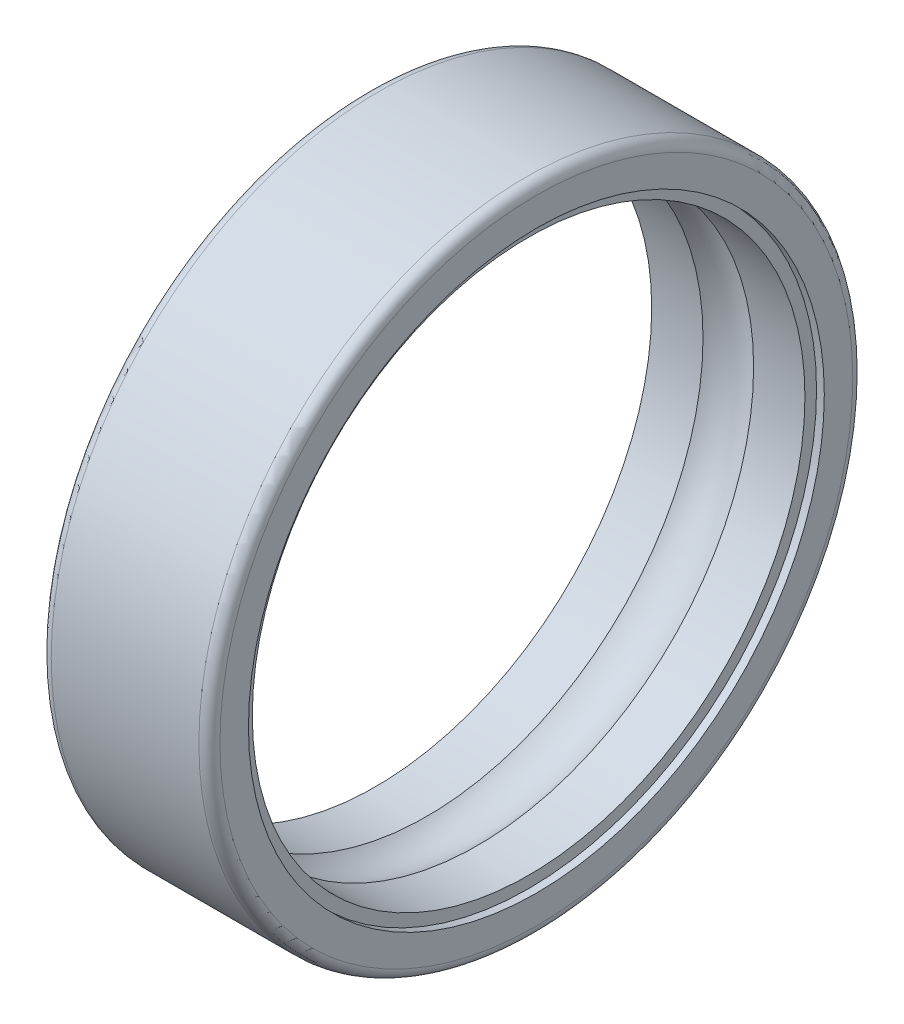
ISO-10303-21;
HEADER;
FILE_DESCRIPTION(('STEP AP214'),'2;1');
FILE_NAME('part.step','',(''),(''),'','','');
FILE_SCHEMA(('AUTOMOTIVE_DESIGN { 1 0 10303 214 1 1 1 1 }'));
ENDSEC;
DATA;
#1=APPLICATION_CONTEXT('core data for automotive mechanical design processes');
#2=APPLICATION_PROTOCOL_DEFINITION('international standard','automotive_design',2000,#1);
#3=PRODUCT_CONTEXT('',#1,'mechanical');
#4=PRODUCT('Part','Part','',(#3));
#5=PRODUCT_RELATED_PRODUCT_CATEGORY('part','',(#4));
#6=PRODUCT_DEFINITION_FORMATION('','',#4);
#7=PRODUCT_DEFINITION_CONTEXT('part definition',#1,'design');
#8=PRODUCT_DEFINITION('design','',#6,#7);
#9=PRODUCT_DEFINITION_SHAPE('','',#8);
#10=(LENGTH_UNIT() NAMED_UNIT(*) SI_UNIT(.MILLI.,.METRE.));
#11=(NAMED_UNIT(*) PLANE_ANGLE_UNIT() SI_UNIT($,.RADIAN.));
#12=(NAMED_UNIT(*) SI_UNIT($,.STERADIAN.) SOLID_ANGLE_UNIT());
#13=UNCERTAINTY_MEASURE_WITH_UNIT(LENGTH_MEASURE(1.E-05),#10,'distance_accuracy_value','');
#14=(GEOMETRIC_REPRESENTATION_CONTEXT(3) GLOBAL_UNCERTAINTY_ASSIGNED_CONTEXT((#13)) GLOBAL_UNIT_ASSIGNED_CONTEXT((#10,
#11,#12)) REPRESENTATION_CONTEXT('',''));
#15=CARTESIAN_POINT('',(0.,0.,0.));
#16=DIRECTION('',(0.,0.,1.));
#17=DIRECTION('',(1.,0.,0.));
#18=AXIS2_PLACEMENT_3D('',#15,#16,#17);
#19=CARTESIAN_POINT('',(0.,-30.5572903122836,-30.));
#20=DIRECTION('',(-1.,0.,0.));
#21=DIRECTION('',(0.,0.,1.));
#22=AXIS2_PLACEMENT_3D('',#19,#20,#21);
#23=PLANE('',#22);
#24=CARTESIAN_POINT('',(0.,0.,0.));
#25=DIRECTION('',(-1.,0.,0.));
#26=DIRECTION('',(0.,0.,-1.));
#27=AXIS2_PLACEMENT_3D('',#24,#25,#26);
#28=CIRCLE('',#27,30.);
#29=CARTESIAN_POINT('',(0.,0.,-30.));
#30=VERTEX_POINT('',#29);
#31=EDGE_CURVE('E55',#30,#30,#28,.F.);
#32=ORIENTED_EDGE('',*,*,#31,.F.);
#33=EDGE_LOOP('',(#32));
#34=FACE_BOUND('',#33,.T.);
#35=CARTESIAN_POINT('',(0.,0.,0.));
#36=DIRECTION('',(1.,0.,0.));
#37=DIRECTION('',(0.,0.,1.));
#38=AXIS2_PLACEMENT_3D('',#35,#36,#37);
#39=CIRCLE('',#38,27.3);
#40=CARTESIAN_POINT('',(0.,0.,27.3));
#41=VERTEX_POINT('',#40);
#42=EDGE_CURVE('E52',#41,#41,#39,.T.);
#43=ORIENTED_EDGE('',*,*,#42,.T.);
#44=EDGE_LOOP('',(#43));
#45=FACE_BOUND('',#44,.T.);
#46=ADVANCED_FACE('F14',(#34,#45),#23,.T.);
#47=CARTESIAN_POINT('',(0.736,-27.8071341841781,-27.3));
#48=DIRECTION('',(-1.,0.,0.));
#49=DIRECTION('',(0.,0.,1.));
#50=AXIS2_PLACEMENT_3D('',#47,#48,#49);
#51=PLANE('',#50);
#52=CARTESIAN_POINT('',(0.736,0.,0.));
#53=DIRECTION('',(-1.,0.,0.));
#54=DIRECTION('',(0.,0.,-1.));
#55=AXIS2_PLACEMENT_3D('',#52,#53,#54);
#56=CIRCLE('',#55,27.3);
#57=CARTESIAN_POINT('',(0.736,0.,-27.3));
#58=VERTEX_POINT('',#57);
#59=EDGE_CURVE('E49',#58,#58,#56,.F.);
#60=ORIENTED_EDGE('',*,*,#59,.F.);
#61=EDGE_LOOP('',(#60));
#62=FACE_BOUND('',#61,.T.);
#63=CARTESIAN_POINT('',(0.736,0.,0.));
#64=DIRECTION('',(1.,0.,0.));
#65=DIRECTION('',(0.,0.,1.));
#66=AXIS2_PLACEMENT_3D('',#63,#64,#65);
#67=CIRCLE('',#66,26.2);
#68=CARTESIAN_POINT('',(0.736,0.,26.2));
#69=VERTEX_POINT('',#68);
#70=EDGE_CURVE('E46',#69,#69,#67,.T.);
#71=ORIENTED_EDGE('',*,*,#70,.T.);
#72=EDGE_LOOP('',(#71));
#73=FACE_BOUND('',#72,.T.);
#74=ADVANCED_FACE('F63',(#62,#73),#51,.T.);
#75=CARTESIAN_POINT('',(15.264,-27.8071341841781,27.3));
#76=DIRECTION('',(1.,0.,0.));
#77=DIRECTION('',(0.,0.,-1.));
#78=AXIS2_PLACEMENT_3D('',#75,#76,#77);
#79=PLANE('',#78);
#80=CARTESIAN_POINT('',(15.264,0.,0.));
#81=DIRECTION('',(1.,0.,0.));
#82=DIRECTION('',(0.,0.,1.));
#83=AXIS2_PLACEMENT_3D('',#80,#81,#82);
#84=CIRCLE('',#83,27.3);
#85=CARTESIAN_POINT('',(15.264,0.,27.3));
#86=VERTEX_POINT('',#85);
#87=EDGE_CURVE('E43',#86,#86,#84,.T.);
#88=ORIENTED_EDGE('',*,*,#87,.T.);
#89=EDGE_LOOP('',(#88));
#90=FACE_BOUND('',#89,.T.);
#91=CARTESIAN_POINT('',(15.264,0.,0.));
#92=DIRECTION('',(-1.,0.,0.));
#93=DIRECTION('',(0.,0.,-1.));
#94=AXIS2_PLACEMENT_3D('',#91,#92,#93);
#95=CIRCLE('',#94,26.2);
#96=CARTESIAN_POINT('',(15.264,0.,-26.2));
#97=VERTEX_POINT('',#96);
#98=EDGE_CURVE('E40',#97,#97,#95,.F.);
#99=ORIENTED_EDGE('',*,*,#98,.F.);
#100=EDGE_LOOP('',(#99));
#101=FACE_BOUND('',#100,.T.);
#102=ADVANCED_FACE('F81',(#90,#101),#79,.T.);
#103=CARTESIAN_POINT('',(16.,-30.5572903122836,30.));
#104=DIRECTION('',(1.,0.,0.));
#105=DIRECTION('',(0.,0.,-1.));
#106=AXIS2_PLACEMENT_3D('',#103,#104,#105);
#107=PLANE('',#106);
#108=CARTESIAN_POINT('',(16.,0.,0.));
#109=DIRECTION('',(1.,0.,0.));
#110=DIRECTION('',(0.,0.,1.));
#111=AXIS2_PLACEMENT_3D('',#108,#109,#110);
#112=CIRCLE('',#111,30.);
#113=CARTESIAN_POINT('',(16.,0.,30.));
#114=VERTEX_POINT('',#113);
#115=EDGE_CURVE('E37',#114,#114,#112,.T.);
#116=ORIENTED_EDGE('',*,*,#115,.T.);
#117=EDGE_LOOP('',(#116));
#118=FACE_BOUND('',#117,.T.);
#119=CARTESIAN_POINT('',(16.,0.,0.));
#120=DIRECTION('',(-1.,0.,0.));
#121=DIRECTION('',(0.,0.,-1.));
#122=AXIS2_PLACEMENT_3D('',#119,#120,#121);
#123=CIRCLE('',#122,27.3);
#124=CARTESIAN_POINT('',(16.,0.,-27.3));
#125=VERTEX_POINT('',#124);
#126=EDGE_CURVE('E34',#125,#125,#123,.F.);
#127=ORIENTED_EDGE('',*,*,#126,.F.);
#128=EDGE_LOOP('',(#127));
#129=FACE_BOUND('',#128,.T.);
#130=ADVANCED_FACE('F70',(#118,#129),#107,.T.);
#131=CARTESIAN_POINT('',(16.,0.,0.));
#132=DIRECTION('',(1.,0.,0.));
#133=DIRECTION('',(0.,0.,1.));
#134=AXIS2_PLACEMENT_3D('',#131,#132,#133);
#135=CYLINDRICAL_SURFACE('',#134,27.3);
#136=ORIENTED_EDGE('',*,*,#59,.T.);
#137=EDGE_LOOP('',(#136));
#138=FACE_BOUND('',#137,.T.);
#139=ORIENTED_EDGE('',*,*,#42,.F.);
#140=EDGE_LOOP('',(#139));
#141=FACE_BOUND('',#140,.T.);
#142=ADVANCED_FACE('F67',(#138,#141),#135,.F.);
#143=CARTESIAN_POINT('',(16.,0.,0.));
#144=DIRECTION('',(1.,0.,0.));
#145=DIRECTION('',(0.,0.,1.));
#146=AXIS2_PLACEMENT_3D('',#143,#144,#145);
#147=CYLINDRICAL_SURFACE('',#146,26.2);
#148=CARTESIAN_POINT('',(5.6,0.,0.));
#149=DIRECTION('',(1.,0.,0.));
#150=DIRECTION('',(0.,0.,1.));
#151=AXIS2_PLACEMENT_3D('',#148,#149,#150);
#152=CIRCLE('',#151,26.2);
#153=CARTESIAN_POINT('',(5.6,0.,26.2));
#154=VERTEX_POINT('',#153);
#155=EDGE_CURVE('E29',#154,#154,#152,.T.);
#156=ORIENTED_EDGE('',*,*,#155,.T.);
#157=EDGE_LOOP('',(#156));
#158=FACE_BOUND('',#157,.T.);
#159=ORIENTED_EDGE('',*,*,#70,.F.);
#160=EDGE_LOOP('',(#159));
#161=FACE_BOUND('',#160,.T.);
#162=ADVANCED_FACE('F69',(#158,#161),#147,.F.);
#163=CARTESIAN_POINT('',(8.,0.,0.));
#164=DIRECTION('',(1.,0.,0.));
#165=DIRECTION('',(0.,0.,1.));
#166=AXIS2_PLACEMENT_3D('',#163,#164,#165);
#167=TOROIDAL_SURFACE('',#166,23.,4.);
#168=ORIENTED_EDGE('',*,*,#155,.F.);
#169=EDGE_LOOP('',(#168));
#170=FACE_BOUND('',#169,.T.);
#171=CARTESIAN_POINT('',(10.4,0.,0.));
#172=DIRECTION('',(1.,0.,0.));
#173=DIRECTION('',(0.,-1.92320703466667E-10,1.));
#174=AXIS2_PLACEMENT_3D('',#171,#172,#173);
#175=CIRCLE('',#174,26.2);
#176=CARTESIAN_POINT('',(10.4,-5.03880243082668E-09,26.2));
#177=VERTEX_POINT('',#176);
#178=EDGE_CURVE('E25',#177,#177,#175,.T.);
#179=ORIENTED_EDGE('',*,*,#178,.T.);
#180=EDGE_LOOP('',(#179));
#181=FACE_BOUND('',#180,.T.);
#182=ADVANCED_FACE('F78',(#170,#181),#167,.F.);
#183=CARTESIAN_POINT('',(16.,0.,0.));
#184=DIRECTION('',(1.,0.,0.));
#185=DIRECTION('',(0.,0.,1.));
#186=AXIS2_PLACEMENT_3D('',#183,#184,#185);
#187=CYLINDRICAL_SURFACE('',#186,26.2);
#188=ORIENTED_EDGE('',*,*,#98,.T.);
#189=EDGE_LOOP('',(#188));
#190=FACE_BOUND('',#189,.T.);
#191=ORIENTED_EDGE('',*,*,#178,.F.);
#192=EDGE_LOOP('',(#191));
#193=FACE_BOUND('',#192,.T.);
#194=ADVANCED_FACE('F88',(#190,#193),#187,.F.);
#195=CARTESIAN_POINT('',(16.,0.,0.));
#196=DIRECTION('',(1.,0.,0.));
#197=DIRECTION('',(0.,0.,1.));
#198=AXIS2_PLACEMENT_3D('',#195,#196,#197);
#199=CYLINDRICAL_SURFACE('',#198,27.3);
#200=ORIENTED_EDGE('',*,*,#126,.T.);
#201=EDGE_LOOP('',(#200));
#202=FACE_BOUND('',#201,.T.);
#203=ORIENTED_EDGE('',*,*,#87,.F.);
#204=EDGE_LOOP('',(#203));
#205=FACE_BOUND('',#204,.T.);
#206=ADVANCED_FACE('F92',(#202,#205),#199,.F.);
#207=CARTESIAN_POINT('',(15.0000000000016,0.,0.));
#208=DIRECTION('',(1.,0.,0.));
#209=DIRECTION('',(0.,0.,1.));
#210=AXIS2_PLACEMENT_3D('',#207,#208,#209);
#211=TOROIDAL_SURFACE('',#210,30.0000000000015,0.999999999998448);
#212=CARTESIAN_POINT('',(15.0000000000016,0.,0.));
#213=DIRECTION('',(1.,0.,0.));
#214=DIRECTION('',(0.,0.,1.));
#215=AXIS2_PLACEMENT_3D('',#212,#213,#214);
#216=CIRCLE('',#215,31.);
#217=CARTESIAN_POINT('',(15.0000000000016,0.,31.));
#218=VERTEX_POINT('',#217);
#219=EDGE_CURVE('E21',#218,#218,#216,.T.);
#220=ORIENTED_EDGE('',*,*,#219,.T.);
#221=EDGE_LOOP('',(#220));
#222=FACE_BOUND('',#221,.T.);
#223=ORIENTED_EDGE('',*,*,#115,.F.);
#224=EDGE_LOOP('',(#223));
#225=FACE_BOUND('',#224,.T.);
#226=ADVANCED_FACE('F96',(#222,#225),#211,.T.);
#227=CARTESIAN_POINT('',(16.,0.,0.));
#228=DIRECTION('',(1.,0.,0.));
#229=DIRECTION('',(0.,0.,1.));
#230=AXIS2_PLACEMENT_3D('',#227,#228,#229);
#231=CYLINDRICAL_SURFACE('',#230,31.);
#232=CARTESIAN_POINT('',(1.,0.,0.));
#233=DIRECTION('',(1.,0.,0.));
#234=DIRECTION('',(0.,0.,1.));
#235=AXIS2_PLACEMENT_3D('',#232,#233,#234);
#236=CIRCLE('',#235,31.);
#237=CARTESIAN_POINT('',(1.,0.,31.));
#238=VERTEX_POINT('',#237);
#239=EDGE_CURVE('E9',#238,#238,#236,.T.);
#240=ORIENTED_EDGE('',*,*,#239,.T.);
#241=EDGE_LOOP('',(#240));
#242=FACE_BOUND('',#241,.T.);
#243=ORIENTED_EDGE('',*,*,#219,.F.);
#244=EDGE_LOOP('',(#243));
#245=FACE_BOUND('',#244,.T.);
#246=ADVANCED_FACE('F99',(#242,#245),#231,.T.);
#247=CARTESIAN_POINT('',(0.99999999999922,0.,0.));
#248=DIRECTION('',(1.,0.,0.));
#249=DIRECTION('',(0.,0.,1.));
#250=AXIS2_PLACEMENT_3D('',#247,#248,#249);
#251=TOROIDAL_SURFACE('',#250,30.0000000000008,0.99999999999922);
#252=ORIENTED_EDGE('',*,*,#31,.T.);
#253=EDGE_LOOP('',(#252));
#254=FACE_BOUND('',#253,.T.);
#255=ORIENTED_EDGE('',*,*,#239,.F.);
#256=EDGE_LOOP('',(#255));
#257=FACE_BOUND('',#256,.T.);
#258=ADVANCED_FACE('F16',(#254,#257),#251,.T.);
#259=CLOSED_SHELL('',(#46,#74,#102,#130,#142,#162,#182,#194,#206,#226,#246,#258));
#260=MANIFOLD_SOLID_BREP('B1',#259);
#261=ADVANCED_BREP_SHAPE_REPRESENTATION('',(#18,#260),#14);
#262=SHAPE_DEFINITION_REPRESENTATION(#9,#261);
ENDSEC;
END-ISO-10303-21;
